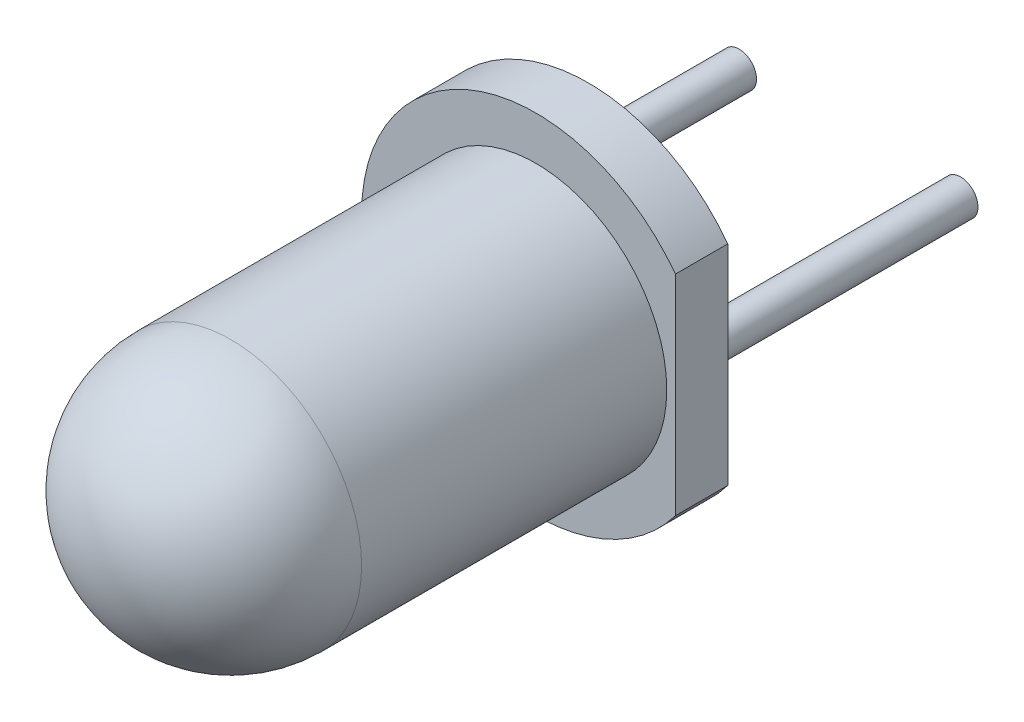
ISO-10303-21;
HEADER;
FILE_DESCRIPTION(('STEP AP214'),'2;1');
FILE_NAME('part.step','',(''),(''),'','','');
FILE_SCHEMA(('AUTOMOTIVE_DESIGN { 1 0 10303 214 1 1 1 1 }'));
ENDSEC;
DATA;
#1=APPLICATION_CONTEXT('core data for automotive mechanical design processes');
#2=APPLICATION_PROTOCOL_DEFINITION('international standard','automotive_design',2000,#1);
#3=PRODUCT_CONTEXT('',#1,'mechanical');
#4=PRODUCT('Part','Part','',(#3));
#5=PRODUCT_RELATED_PRODUCT_CATEGORY('part','',(#4));
#6=PRODUCT_DEFINITION_FORMATION('','',#4);
#7=PRODUCT_DEFINITION_CONTEXT('part definition',#1,'design');
#8=PRODUCT_DEFINITION('design','',#6,#7);
#9=PRODUCT_DEFINITION_SHAPE('','',#8);
#10=(LENGTH_UNIT() NAMED_UNIT(*) SI_UNIT(.MILLI.,.METRE.));
#11=(NAMED_UNIT(*) PLANE_ANGLE_UNIT() SI_UNIT($,.RADIAN.));
#12=(NAMED_UNIT(*) SI_UNIT($,.STERADIAN.) SOLID_ANGLE_UNIT());
#13=UNCERTAINTY_MEASURE_WITH_UNIT(LENGTH_MEASURE(1.E-05),#10,'distance_accuracy_value','');
#14=(GEOMETRIC_REPRESENTATION_CONTEXT(3) GLOBAL_UNCERTAINTY_ASSIGNED_CONTEXT((#13)) GLOBAL_UNIT_ASSIGNED_CONTEXT((#10,
#11,#12)) REPRESENTATION_CONTEXT('',''));
#15=CARTESIAN_POINT('',(0.,0.,0.));
#16=DIRECTION('',(0.,0.,1.));
#17=DIRECTION('',(1.,0.,0.));
#18=AXIS2_PLACEMENT_3D('',#15,#16,#17);
#19=CARTESIAN_POINT('',(0.,0.,0.));
#20=DIRECTION('',(0.,0.,1.));
#21=DIRECTION('',(1.,0.,0.));
#22=AXIS2_PLACEMENT_3D('',#19,#20,#21);
#23=PLANE('',#22);
#24=CARTESIAN_POINT('',(0.,0.,0.));
#25=DIRECTION('',(0.,0.,1.));
#26=DIRECTION('',(1.,0.,0.));
#27=AXIS2_PLACEMENT_3D('',#24,#25,#26);
#28=CIRCLE('',#27,2.);
#29=CARTESIAN_POINT('',(1.6,1.2,0.));
#30=VERTEX_POINT('',#29);
#31=CARTESIAN_POINT('',(1.6,-1.2,0.));
#32=VERTEX_POINT('',#31);
#33=EDGE_CURVE('E78',#30,#32,#28,.T.);
#34=ORIENTED_EDGE('',*,*,#33,.F.);
#35=DIRECTION('',(0.,1.,0.));
#36=VECTOR('',#35,1.);
#37=CARTESIAN_POINT('',(1.6,1.2,0.));
#38=LINE('',#37,#36);
#39=EDGE_CURVE('E66',#32,#30,#38,.T.);
#40=ORIENTED_EDGE('',*,*,#39,.F.);
#41=EDGE_LOOP('',(#34,#40));
#42=FACE_BOUND('',#41,.T.);
#43=CARTESIAN_POINT('',(-1.27,0.,0.));
#44=DIRECTION('',(0.,0.,1.));
#45=DIRECTION('',(1.,0.,0.));
#46=AXIS2_PLACEMENT_3D('',#43,#44,#45);
#47=CIRCLE('',#46,0.2);
#48=CARTESIAN_POINT('',(-1.07,0.,0.));
#49=VERTEX_POINT('',#48);
#50=EDGE_CURVE('E51',#49,#49,#47,.F.);
#51=ORIENTED_EDGE('',*,*,#50,.F.);
#52=EDGE_LOOP('',(#51));
#53=FACE_BOUND('',#52,.T.);
#54=CARTESIAN_POINT('',(1.27000000000261,0.,0.));
#55=DIRECTION('',(0.,0.,1.));
#56=DIRECTION('',(1.,0.,0.));
#57=AXIS2_PLACEMENT_3D('',#54,#55,#56);
#58=CIRCLE('',#57,0.2);
#59=CARTESIAN_POINT('',(1.47000000000261,0.,0.));
#60=VERTEX_POINT('',#59);
#61=EDGE_CURVE('E11',#60,#60,#58,.F.);
#62=ORIENTED_EDGE('',*,*,#61,.F.);
#63=EDGE_LOOP('',(#62));
#64=FACE_BOUND('',#63,.T.);
#65=ADVANCED_FACE('F41',(#42,#53,#64),#23,.F.);
#66=CARTESIAN_POINT('',(0.,0.,0.6));
#67=DIRECTION('',(0.,0.,1.));
#68=DIRECTION('',(1.,0.,0.));
#69=AXIS2_PLACEMENT_3D('',#66,#67,#68);
#70=PLANE('',#69);
#71=CARTESIAN_POINT('',(0.,0.,0.6));
#72=DIRECTION('',(0.,0.,1.));
#73=DIRECTION('',(1.,0.,0.));
#74=AXIS2_PLACEMENT_3D('',#71,#72,#73);
#75=CIRCLE('',#74,2.);
#76=CARTESIAN_POINT('',(1.6,1.2,0.6));
#77=VERTEX_POINT('',#76);
#78=CARTESIAN_POINT('',(1.6,-1.2,0.6));
#79=VERTEX_POINT('',#78);
#80=EDGE_CURVE('E77',#77,#79,#75,.T.);
#81=ORIENTED_EDGE('',*,*,#80,.T.);
#82=DIRECTION('',(0.,1.,0.));
#83=VECTOR('',#82,1.);
#84=CARTESIAN_POINT('',(1.6,1.2,0.6));
#85=LINE('',#84,#83);
#86=EDGE_CURVE('E58',#79,#77,#85,.T.);
#87=ORIENTED_EDGE('',*,*,#86,.T.);
#88=EDGE_LOOP('',(#81,#87));
#89=FACE_BOUND('',#88,.T.);
#90=CARTESIAN_POINT('',(0.,0.,0.6));
#91=DIRECTION('',(0.,0.,1.));
#92=DIRECTION('',(1.,0.,0.));
#93=AXIS2_PLACEMENT_3D('',#90,#91,#92);
#94=CIRCLE('',#93,1.5);
#95=CARTESIAN_POINT('',(1.5,0.,0.6));
#96=VERTEX_POINT('',#95);
#97=EDGE_CURVE('E86',#96,#96,#94,.T.);
#98=ORIENTED_EDGE('',*,*,#97,.F.);
#99=EDGE_LOOP('',(#98));
#100=FACE_BOUND('',#99,.T.);
#101=ADVANCED_FACE('F110',(#89,#100),#70,.T.);
#102=CARTESIAN_POINT('',(0.,0.,0.6));
#103=DIRECTION('',(0.,0.,-1.));
#104=DIRECTION('',(-1.,0.,0.));
#105=AXIS2_PLACEMENT_3D('',#102,#103,#104);
#106=CYLINDRICAL_SURFACE('',#105,2.);
#107=ORIENTED_EDGE('',*,*,#33,.T.);
#108=DIRECTION('',(0.,0.,-1.));
#109=VECTOR('',#108,1.);
#110=CARTESIAN_POINT('',(1.6,-1.2,0.6));
#111=LINE('',#110,#109);
#112=EDGE_CURVE('E74',#79,#32,#111,.T.);
#113=ORIENTED_EDGE('',*,*,#112,.F.);
#114=ORIENTED_EDGE('',*,*,#80,.F.);
#115=DIRECTION('',(0.,0.,-1.));
#116=VECTOR('',#115,1.);
#117=CARTESIAN_POINT('',(1.6,1.2,0.6));
#118=LINE('',#117,#116);
#119=EDGE_CURVE('E71',#77,#30,#118,.T.);
#120=ORIENTED_EDGE('',*,*,#119,.T.);
#121=EDGE_LOOP('',(#107,#113,#114,#120));
#122=FACE_BOUND('',#121,.T.);
#123=ADVANCED_FACE('F81',(#122),#106,.T.);
#124=CARTESIAN_POINT('',(1.6,1.2,0.6));
#125=DIRECTION('',(-1.,0.,0.));
#126=DIRECTION('',(0.,-1.,0.));
#127=AXIS2_PLACEMENT_3D('',#124,#125,#126);
#128=PLANE('',#127);
#129=ORIENTED_EDGE('',*,*,#39,.T.);
#130=ORIENTED_EDGE('',*,*,#119,.F.);
#131=ORIENTED_EDGE('',*,*,#86,.F.);
#132=ORIENTED_EDGE('',*,*,#112,.T.);
#133=EDGE_LOOP('',(#129,#130,#131,#132));
#134=FACE_BOUND('',#133,.T.);
#135=ADVANCED_FACE('F70',(#134),#128,.F.);
#136=CARTESIAN_POINT('',(0.,0.,5.6));
#137=DIRECTION('',(0.,0.,-1.));
#138=DIRECTION('',(-1.,0.,0.));
#139=AXIS2_PLACEMENT_3D('',#136,#137,#138);
#140=CYLINDRICAL_SURFACE('',#139,1.5);
#141=CARTESIAN_POINT('',(0.,0.,4.1));
#142=DIRECTION('',(0.,0.,-1.));
#143=DIRECTION('',(-1.,0.,0.));
#144=AXIS2_PLACEMENT_3D('',#141,#142,#143);
#145=CIRCLE('',#144,1.5);
#146=CARTESIAN_POINT('',(-1.5,0.,4.1));
#147=VERTEX_POINT('',#146);
#148=EDGE_CURVE('E99',#147,#147,#145,.T.);
#149=ORIENTED_EDGE('',*,*,#148,.T.);
#150=EDGE_LOOP('',(#149));
#151=FACE_BOUND('',#150,.T.);
#152=ORIENTED_EDGE('',*,*,#97,.T.);
#153=EDGE_LOOP('',(#152));
#154=FACE_BOUND('',#153,.T.);
#155=ADVANCED_FACE('F133',(#151,#154),#140,.T.);
#156=CARTESIAN_POINT('',(0.,0.,4.1));
#157=DIRECTION('',(0.,0.,1.));
#158=DIRECTION('',(1.,0.,0.));
#159=AXIS2_PLACEMENT_3D('',#156,#157,#158);
#160=SPHERICAL_SURFACE('',#159,1.5);
#161=ORIENTED_EDGE('',*,*,#148,.F.);
#162=EDGE_LOOP('',(#161));
#163=FACE_BOUND('',#162,.T.);
#164=ADVANCED_FACE('F43',(#163),#160,.T.);
#165=CARTESIAN_POINT('',(-1.27,0.,-3.));
#166=DIRECTION('',(0.,0.,1.));
#167=DIRECTION('',(1.,0.,0.));
#168=AXIS2_PLACEMENT_3D('',#165,#166,#167);
#169=CYLINDRICAL_SURFACE('',#168,0.2);
#170=CARTESIAN_POINT('',(-1.27,0.,-3.));
#171=DIRECTION('',(0.,0.,-1.));
#172=DIRECTION('',(-1.,0.,0.));
#173=AXIS2_PLACEMENT_3D('',#170,#171,#172);
#174=CIRCLE('',#173,0.2);
#175=CARTESIAN_POINT('',(-1.47,0.,-3.));
#176=VERTEX_POINT('',#175);
#177=EDGE_CURVE('E92',#176,#176,#174,.T.);
#178=ORIENTED_EDGE('',*,*,#177,.F.);
#179=EDGE_LOOP('',(#178));
#180=FACE_BOUND('',#179,.T.);
#181=ORIENTED_EDGE('',*,*,#50,.T.);
#182=EDGE_LOOP('',(#181));
#183=FACE_BOUND('',#182,.T.);
#184=ADVANCED_FACE('F107',(#180,#183),#169,.T.);
#185=CARTESIAN_POINT('',(-1.27,0.,-3.));
#186=DIRECTION('',(0.,0.,-1.));
#187=DIRECTION('',(-1.,0.,0.));
#188=AXIS2_PLACEMENT_3D('',#185,#186,#187);
#189=PLANE('',#188);
#190=ORIENTED_EDGE('',*,*,#177,.T.);
#191=EDGE_LOOP('',(#190));
#192=FACE_BOUND('',#191,.T.);
#193=ADVANCED_FACE('F117',(#192),#189,.T.);
#194=CARTESIAN_POINT('',(1.27000000000261,0.,-3.));
#195=DIRECTION('',(0.,0.,1.));
#196=DIRECTION('',(1.,0.,0.));
#197=AXIS2_PLACEMENT_3D('',#194,#195,#196);
#198=CYLINDRICAL_SURFACE('',#197,0.2);
#199=CARTESIAN_POINT('',(1.27000000000261,0.,-3.));
#200=DIRECTION('',(0.,0.,-1.));
#201=DIRECTION('',(-1.,0.,0.));
#202=AXIS2_PLACEMENT_3D('',#199,#200,#201);
#203=CIRCLE('',#202,0.2);
#204=CARTESIAN_POINT('',(1.07000000000261,0.,-3.));
#205=VERTEX_POINT('',#204);
#206=EDGE_CURVE('E231',#205,#205,#203,.T.);
#207=ORIENTED_EDGE('',*,*,#206,.F.);
#208=EDGE_LOOP('',(#207));
#209=FACE_BOUND('',#208,.T.);
#210=ORIENTED_EDGE('',*,*,#61,.T.);
#211=EDGE_LOOP('',(#210));
#212=FACE_BOUND('',#211,.T.);
#213=ADVANCED_FACE('F114',(#209,#212),#198,.T.);
#214=CARTESIAN_POINT('',(1.27000000000261,0.,-3.));
#215=DIRECTION('',(0.,0.,-1.));
#216=DIRECTION('',(-1.,0.,0.));
#217=AXIS2_PLACEMENT_3D('',#214,#215,#216);
#218=PLANE('',#217);
#219=ORIENTED_EDGE('',*,*,#206,.T.);
#220=EDGE_LOOP('',(#219));
#221=FACE_BOUND('',#220,.T.);
#222=ADVANCED_FACE('F116',(#221),#218,.T.);
#223=CLOSED_SHELL('',(#65,#101,#123,#135,#155,#164,#184,#193,#213,#222));
#224=MANIFOLD_SOLID_BREP('B2',#223);
#225=ADVANCED_BREP_SHAPE_REPRESENTATION('',(#18,#224),#14);
#226=SHAPE_DEFINITION_REPRESENTATION(#9,#225);
ENDSEC;
END-ISO-10303-21;
